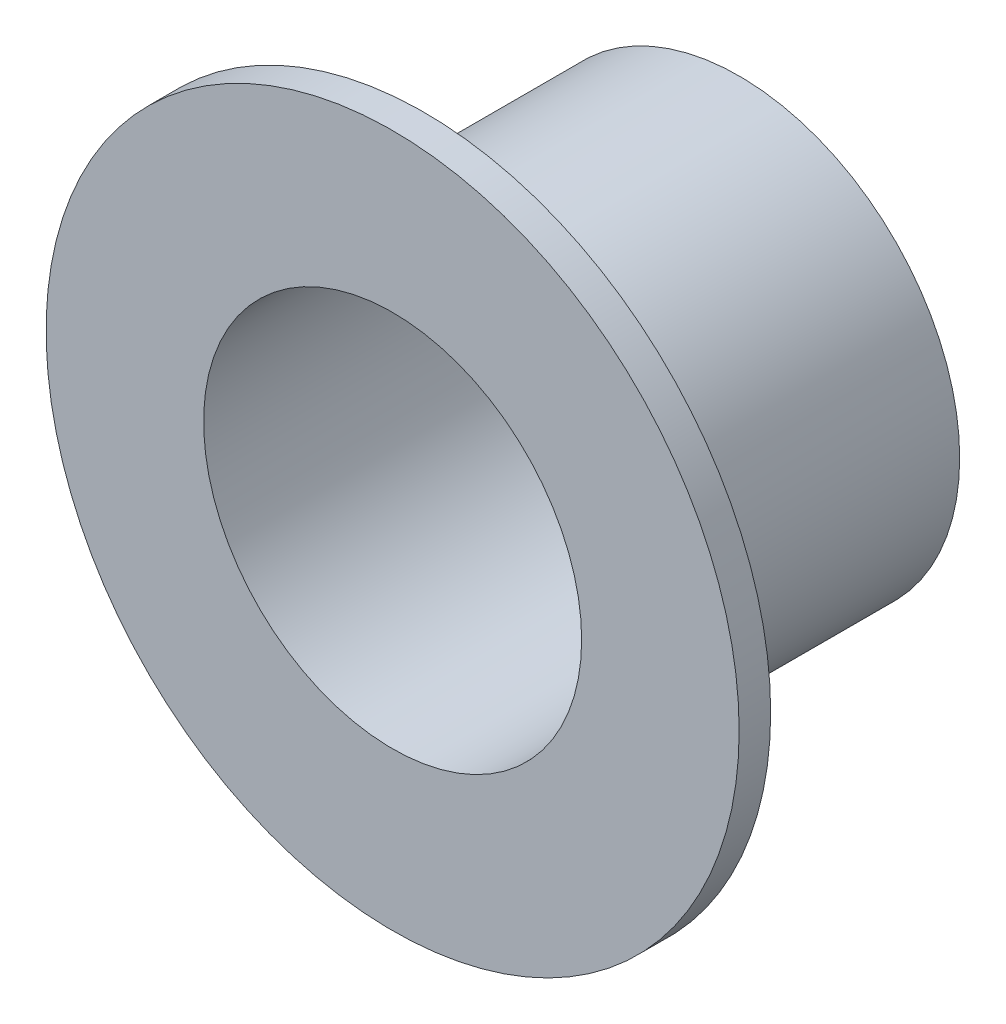
ISO-10303-21;
HEADER;
FILE_DESCRIPTION(('STEP AP214'),'2;1');
FILE_NAME('part.step','',(''),(''),'','','');
FILE_SCHEMA(('AUTOMOTIVE_DESIGN { 1 0 10303 214 1 1 1 1 }'));
ENDSEC;
DATA;
#1=APPLICATION_CONTEXT('core data for automotive mechanical design processes');
#2=APPLICATION_PROTOCOL_DEFINITION('international standard','automotive_design',2000,#1);
#3=PRODUCT_CONTEXT('',#1,'mechanical');
#4=PRODUCT('Part','Part','',(#3));
#5=PRODUCT_RELATED_PRODUCT_CATEGORY('part','',(#4));
#6=PRODUCT_DEFINITION_FORMATION('','',#4);
#7=PRODUCT_DEFINITION_CONTEXT('part definition',#1,'design');
#8=PRODUCT_DEFINITION('design','',#6,#7);
#9=PRODUCT_DEFINITION_SHAPE('','',#8);
#10=(LENGTH_UNIT() NAMED_UNIT(*) SI_UNIT(.MILLI.,.METRE.));
#11=(NAMED_UNIT(*) PLANE_ANGLE_UNIT() SI_UNIT($,.RADIAN.));
#12=(NAMED_UNIT(*) SI_UNIT($,.STERADIAN.) SOLID_ANGLE_UNIT());
#13=UNCERTAINTY_MEASURE_WITH_UNIT(LENGTH_MEASURE(1.E-05),#10,'distance_accuracy_value','');
#14=(GEOMETRIC_REPRESENTATION_CONTEXT(3) GLOBAL_UNCERTAINTY_ASSIGNED_CONTEXT((#13)) GLOBAL_UNIT_ASSIGNED_CONTEXT((#10,
#11,#12)) REPRESENTATION_CONTEXT('',''));
#15=CARTESIAN_POINT('',(0.,0.,0.));
#16=DIRECTION('',(0.,0.,1.));
#17=DIRECTION('',(1.,0.,0.));
#18=AXIS2_PLACEMENT_3D('',#15,#16,#17);
#19=CARTESIAN_POINT('',(0.,0.,5.5));
#20=DIRECTION('',(0.,0.,-1.));
#21=DIRECTION('',(-1.,0.,0.));
#22=AXIS2_PLACEMENT_3D('',#19,#20,#21);
#23=CYLINDRICAL_SURFACE('',#22,3.5);
#24=CARTESIAN_POINT('',(0.,0.,0.));
#25=DIRECTION('',(0.,0.,1.));
#26=DIRECTION('',(1.,0.,0.));
#27=AXIS2_PLACEMENT_3D('',#24,#25,#26);
#28=CIRCLE('',#27,3.5);
#29=CARTESIAN_POINT('',(3.5,0.,0.));
#30=VERTEX_POINT('',#29);
#31=EDGE_CURVE('E38',#30,#30,#28,.T.);
#32=ORIENTED_EDGE('',*,*,#31,.T.);
#33=EDGE_LOOP('',(#32));
#34=FACE_BOUND('',#33,.T.);
#35=CARTESIAN_POINT('',(0.,0.,5.));
#36=DIRECTION('',(0.,0.,1.));
#37=DIRECTION('',(1.,0.,0.));
#38=AXIS2_PLACEMENT_3D('',#35,#36,#37);
#39=CIRCLE('',#38,3.5);
#40=CARTESIAN_POINT('',(3.5,0.,5.));
#41=VERTEX_POINT('',#40);
#42=EDGE_CURVE('E10',#41,#41,#39,.T.);
#43=ORIENTED_EDGE('',*,*,#42,.F.);
#44=EDGE_LOOP('',(#43));
#45=FACE_BOUND('',#44,.T.);
#46=ADVANCED_FACE('F35',(#34,#45),#23,.T.);
#47=CARTESIAN_POINT('',(0.,0.,5.5));
#48=DIRECTION('',(0.,0.,1.));
#49=DIRECTION('',(1.,0.,0.));
#50=AXIS2_PLACEMENT_3D('',#47,#48,#49);
#51=PLANE('',#50);
#52=CARTESIAN_POINT('',(0.,0.,5.5));
#53=DIRECTION('',(0.,0.,1.));
#54=DIRECTION('',(1.,0.,0.));
#55=AXIS2_PLACEMENT_3D('',#52,#53,#54);
#56=CIRCLE('',#55,3.);
#57=CARTESIAN_POINT('',(3.,0.,5.5));
#58=VERTEX_POINT('',#57);
#59=EDGE_CURVE('E46',#58,#58,#56,.T.);
#60=ORIENTED_EDGE('',*,*,#59,.F.);
#61=EDGE_LOOP('',(#60));
#62=FACE_BOUND('',#61,.T.);
#63=CARTESIAN_POINT('',(0.,0.,5.5));
#64=DIRECTION('',(0.,0.,1.));
#65=DIRECTION('',(1.,0.,0.));
#66=AXIS2_PLACEMENT_3D('',#63,#64,#65);
#67=CIRCLE('',#66,5.5);
#68=CARTESIAN_POINT('',(5.5,0.,5.5));
#69=VERTEX_POINT('',#68);
#70=EDGE_CURVE('E49',#69,#69,#67,.T.);
#71=ORIENTED_EDGE('',*,*,#70,.T.);
#72=EDGE_LOOP('',(#71));
#73=FACE_BOUND('',#72,.T.);
#74=ADVANCED_FACE('F63',(#62,#73),#51,.T.);
#75=CARTESIAN_POINT('',(0.,0.,0.));
#76=DIRECTION('',(0.,0.,1.));
#77=DIRECTION('',(1.,0.,0.));
#78=AXIS2_PLACEMENT_3D('',#75,#76,#77);
#79=PLANE('',#78);
#80=ORIENTED_EDGE('',*,*,#31,.F.);
#81=EDGE_LOOP('',(#80));
#82=FACE_BOUND('',#81,.T.);
#83=CARTESIAN_POINT('',(0.,0.,0.));
#84=DIRECTION('',(0.,0.,1.));
#85=DIRECTION('',(1.,0.,0.));
#86=AXIS2_PLACEMENT_3D('',#83,#84,#85);
#87=CIRCLE('',#86,3.);
#88=CARTESIAN_POINT('',(3.,0.,0.));
#89=VERTEX_POINT('',#88);
#90=EDGE_CURVE('E52',#89,#89,#87,.T.);
#91=ORIENTED_EDGE('',*,*,#90,.T.);
#92=EDGE_LOOP('',(#91));
#93=FACE_BOUND('',#92,.T.);
#94=ADVANCED_FACE('F82',(#82,#93),#79,.F.);
#95=CARTESIAN_POINT('',(0.,0.,5.5));
#96=DIRECTION('',(0.,0.,-1.));
#97=DIRECTION('',(-1.,0.,0.));
#98=AXIS2_PLACEMENT_3D('',#95,#96,#97);
#99=CYLINDRICAL_SURFACE('',#98,3.);
#100=ORIENTED_EDGE('',*,*,#59,.T.);
#101=EDGE_LOOP('',(#100));
#102=FACE_BOUND('',#101,.T.);
#103=ORIENTED_EDGE('',*,*,#90,.F.);
#104=EDGE_LOOP('',(#103));
#105=FACE_BOUND('',#104,.T.);
#106=ADVANCED_FACE('F72',(#102,#105),#99,.F.);
#107=CARTESIAN_POINT('',(0.,0.,5.));
#108=DIRECTION('',(0.,0.,1.));
#109=DIRECTION('',(1.,0.,0.));
#110=AXIS2_PLACEMENT_3D('',#107,#108,#109);
#111=PLANE('',#110);
#112=CARTESIAN_POINT('',(0.,0.,5.));
#113=DIRECTION('',(0.,0.,1.));
#114=DIRECTION('',(1.,0.,0.));
#115=AXIS2_PLACEMENT_3D('',#112,#113,#114);
#116=CIRCLE('',#115,5.5);
#117=CARTESIAN_POINT('',(5.5,0.,5.));
#118=VERTEX_POINT('',#117);
#119=EDGE_CURVE('E54',#118,#118,#116,.T.);
#120=ORIENTED_EDGE('',*,*,#119,.F.);
#121=EDGE_LOOP('',(#120));
#122=FACE_BOUND('',#121,.T.);
#123=ORIENTED_EDGE('',*,*,#42,.T.);
#124=EDGE_LOOP('',(#123));
#125=FACE_BOUND('',#124,.T.);
#126=ADVANCED_FACE('F67',(#122,#125),#111,.F.);
#127=CARTESIAN_POINT('',(0.,0.,5.));
#128=DIRECTION('',(0.,0.,1.));
#129=DIRECTION('',(1.,0.,0.));
#130=AXIS2_PLACEMENT_3D('',#127,#128,#129);
#131=CYLINDRICAL_SURFACE('',#130,5.5);
#132=ORIENTED_EDGE('',*,*,#119,.T.);
#133=EDGE_LOOP('',(#132));
#134=FACE_BOUND('',#133,.T.);
#135=ORIENTED_EDGE('',*,*,#70,.F.);
#136=EDGE_LOOP('',(#135));
#137=FACE_BOUND('',#136,.T.);
#138=ADVANCED_FACE('F65',(#134,#137),#131,.T.);
#139=CLOSED_SHELL('',(#46,#74,#94,#106,#126,#138));
#140=MANIFOLD_SOLID_BREP('B2',#139);
#141=ADVANCED_BREP_SHAPE_REPRESENTATION('',(#18,#140),#14);
#142=SHAPE_DEFINITION_REPRESENTATION(#9,#141);
ENDSEC;
END-ISO-10303-21;
